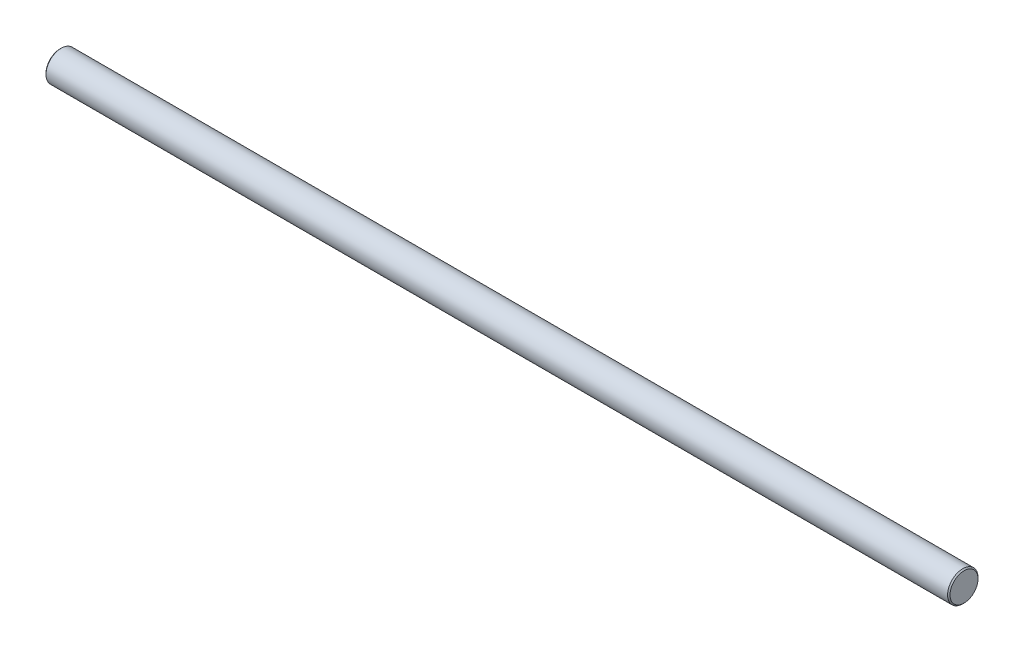
ISO-10303-21;
HEADER;
FILE_DESCRIPTION(('STEP AP214'),'2;1');
FILE_NAME('part.step','',(''),(''),'','','');
FILE_SCHEMA(('AUTOMOTIVE_DESIGN { 1 0 10303 214 1 1 1 1 }'));
ENDSEC;
DATA;
#1=APPLICATION_CONTEXT('core data for automotive mechanical design processes');
#2=APPLICATION_PROTOCOL_DEFINITION('international standard','automotive_design',2000,#1);
#3=PRODUCT_CONTEXT('',#1,'mechanical');
#4=PRODUCT('Part','Part','',(#3));
#5=PRODUCT_RELATED_PRODUCT_CATEGORY('part','',(#4));
#6=PRODUCT_DEFINITION_FORMATION('','',#4);
#7=PRODUCT_DEFINITION_CONTEXT('part definition',#1,'design');
#8=PRODUCT_DEFINITION('design','',#6,#7);
#9=PRODUCT_DEFINITION_SHAPE('','',#8);
#10=(LENGTH_UNIT() NAMED_UNIT(*) SI_UNIT(.MILLI.,.METRE.));
#11=(NAMED_UNIT(*) PLANE_ANGLE_UNIT() SI_UNIT($,.RADIAN.));
#12=(NAMED_UNIT(*) SI_UNIT($,.STERADIAN.) SOLID_ANGLE_UNIT());
#13=UNCERTAINTY_MEASURE_WITH_UNIT(LENGTH_MEASURE(1.E-05),#10,'distance_accuracy_value','');
#14=(GEOMETRIC_REPRESENTATION_CONTEXT(3) GLOBAL_UNCERTAINTY_ASSIGNED_CONTEXT((#13)) GLOBAL_UNIT_ASSIGNED_CONTEXT((#10,
#11,#12)) REPRESENTATION_CONTEXT('',''));
#15=CARTESIAN_POINT('',(0.,0.,0.));
#16=DIRECTION('',(0.,0.,1.));
#17=DIRECTION('',(1.,0.,0.));
#18=AXIS2_PLACEMENT_3D('',#15,#16,#17);
#19=CARTESIAN_POINT('',(742.,11.5,0.));
#20=DIRECTION('',(1.,0.,0.));
#21=DIRECTION('',(0.,1.,0.));
#22=AXIS2_PLACEMENT_3D('',#19,#20,#21);
#23=PLANE('',#22);
#24=CARTESIAN_POINT('',(742.,0.,0.));
#25=DIRECTION('',(-1.,0.,0.));
#26=DIRECTION('',(0.,0.,1.));
#27=AXIS2_PLACEMENT_3D('',#24,#25,#26);
#28=CIRCLE('',#27,11.5);
#29=CARTESIAN_POINT('',(742.,0.,11.5));
#30=VERTEX_POINT('',#29);
#31=EDGE_CURVE('E11',#30,#30,#28,.T.);
#32=ORIENTED_EDGE('',*,*,#31,.F.);
#33=EDGE_LOOP('',(#32));
#34=FACE_BOUND('',#33,.T.);
#35=ADVANCED_FACE('F16',(#34),#23,.T.);
#36=CARTESIAN_POINT('',(741.,0.,0.));
#37=DIRECTION('',(-1.,0.,0.));
#38=DIRECTION('',(0.,0.,1.));
#39=AXIS2_PLACEMENT_3D('',#36,#37,#38);
#40=CONICAL_SURFACE('',#39,12.5,0.7853981625);
#41=CARTESIAN_POINT('',(741.,0.,0.));
#42=DIRECTION('',(-1.,0.,0.));
#43=DIRECTION('',(0.,0.,1.));
#44=AXIS2_PLACEMENT_3D('',#41,#42,#43);
#45=CIRCLE('',#44,12.5);
#46=CARTESIAN_POINT('',(741.,0.,12.5));
#47=VERTEX_POINT('',#46);
#48=EDGE_CURVE('E26',#47,#47,#45,.T.);
#49=ORIENTED_EDGE('',*,*,#48,.F.);
#50=EDGE_LOOP('',(#49));
#51=FACE_BOUND('',#50,.T.);
#52=ORIENTED_EDGE('',*,*,#31,.T.);
#53=EDGE_LOOP('',(#52));
#54=FACE_BOUND('',#53,.T.);
#55=ADVANCED_FACE('F18',(#51,#54),#40,.T.);
#56=CARTESIAN_POINT('',(742.,0.,0.));
#57=DIRECTION('',(-1.,0.,0.));
#58=DIRECTION('',(0.,0.,1.));
#59=AXIS2_PLACEMENT_3D('',#56,#57,#58);
#60=CYLINDRICAL_SURFACE('',#59,12.5);
#61=CARTESIAN_POINT('',(1.,0.,0.));
#62=DIRECTION('',(-1.,0.,0.));
#63=DIRECTION('',(0.,0.,1.));
#64=AXIS2_PLACEMENT_3D('',#61,#62,#63);
#65=CIRCLE('',#64,12.5);
#66=CARTESIAN_POINT('',(1.,0.,12.5));
#67=VERTEX_POINT('',#66);
#68=EDGE_CURVE('E55',#67,#67,#65,.T.);
#69=ORIENTED_EDGE('',*,*,#68,.F.);
#70=EDGE_LOOP('',(#69));
#71=FACE_BOUND('',#70,.T.);
#72=ORIENTED_EDGE('',*,*,#48,.T.);
#73=EDGE_LOOP('',(#72));
#74=FACE_BOUND('',#73,.T.);
#75=ADVANCED_FACE('F70',(#71,#74),#60,.T.);
#76=CARTESIAN_POINT('',(0.,0.,0.));
#77=DIRECTION('',(1.,0.,0.));
#78=DIRECTION('',(0.,0.,-1.));
#79=AXIS2_PLACEMENT_3D('',#76,#77,#78);
#80=CONICAL_SURFACE('',#79,11.5,0.7853981625);
#81=CARTESIAN_POINT('',(0.,0.,0.));
#82=DIRECTION('',(-1.,0.,0.));
#83=DIRECTION('',(0.,0.,1.));
#84=AXIS2_PLACEMENT_3D('',#81,#82,#83);
#85=CIRCLE('',#84,11.5);
#86=CARTESIAN_POINT('',(0.,0.,11.5));
#87=VERTEX_POINT('',#86);
#88=EDGE_CURVE('E20',#87,#87,#85,.T.);
#89=ORIENTED_EDGE('',*,*,#88,.F.);
#90=EDGE_LOOP('',(#89));
#91=FACE_BOUND('',#90,.T.);
#92=ORIENTED_EDGE('',*,*,#68,.T.);
#93=EDGE_LOOP('',(#92));
#94=FACE_BOUND('',#93,.T.);
#95=ADVANCED_FACE('F68',(#91,#94),#80,.T.);
#96=CARTESIAN_POINT('',(0.,0.,0.));
#97=DIRECTION('',(-1.,0.,0.));
#98=DIRECTION('',(0.,0.,1.));
#99=AXIS2_PLACEMENT_3D('',#96,#97,#98);
#100=PLANE('',#99);
#101=ORIENTED_EDGE('',*,*,#88,.T.);
#102=EDGE_LOOP('',(#101));
#103=FACE_BOUND('',#102,.T.);
#104=ADVANCED_FACE('F52',(#103),#100,.T.);
#105=CLOSED_SHELL('',(#35,#55,#75,#95,#104));
#106=MANIFOLD_SOLID_BREP('B1',#105);
#107=ADVANCED_BREP_SHAPE_REPRESENTATION('',(#18,#106),#14);
#108=SHAPE_DEFINITION_REPRESENTATION(#9,#107);
ENDSEC;
END-ISO-10303-21;
